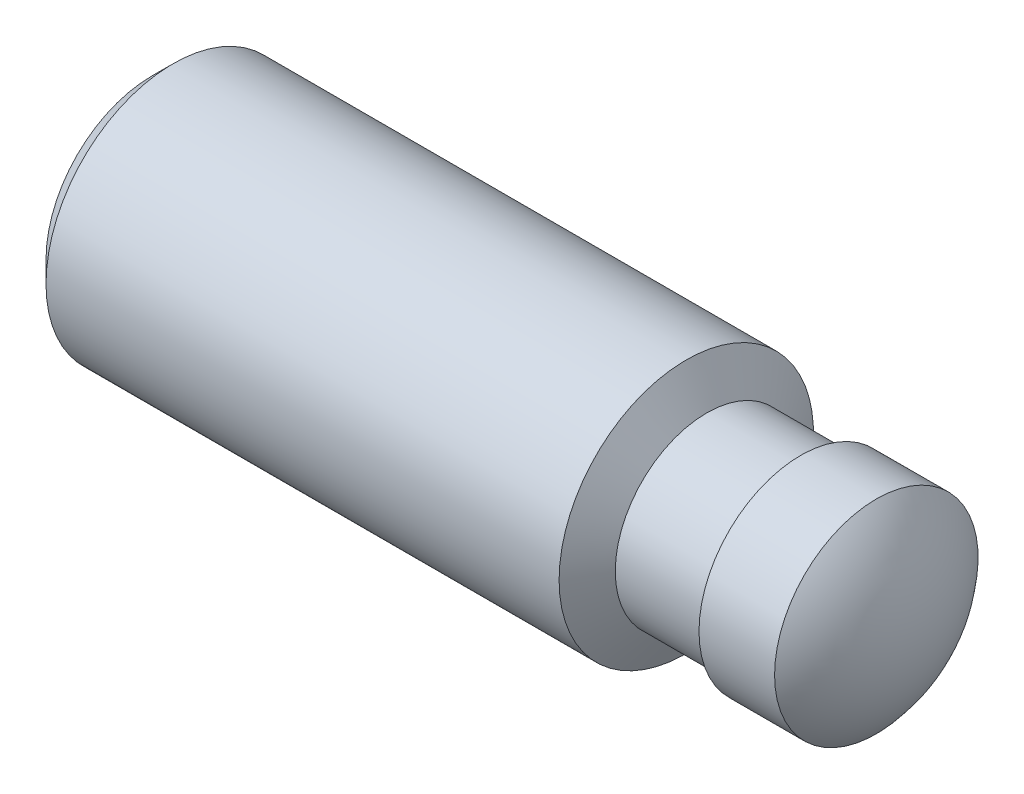
ISO-10303-21;
HEADER;
FILE_DESCRIPTION(('STEP AP214'),'2;1');
FILE_NAME('part.step','',(''),(''),'','','');
FILE_SCHEMA(('AUTOMOTIVE_DESIGN { 1 0 10303 214 1 1 1 1 }'));
ENDSEC;
DATA;
#1=APPLICATION_CONTEXT('core data for automotive mechanical design processes');
#2=APPLICATION_PROTOCOL_DEFINITION('international standard','automotive_design',2000,#1);
#3=PRODUCT_CONTEXT('',#1,'mechanical');
#4=PRODUCT('Part','Part','',(#3));
#5=PRODUCT_RELATED_PRODUCT_CATEGORY('part','',(#4));
#6=PRODUCT_DEFINITION_FORMATION('','',#4);
#7=PRODUCT_DEFINITION_CONTEXT('part definition',#1,'design');
#8=PRODUCT_DEFINITION('design','',#6,#7);
#9=PRODUCT_DEFINITION_SHAPE('','',#8);
#10=(LENGTH_UNIT() NAMED_UNIT(*) SI_UNIT(.MILLI.,.METRE.));
#11=(NAMED_UNIT(*) PLANE_ANGLE_UNIT() SI_UNIT($,.RADIAN.));
#12=(NAMED_UNIT(*) SI_UNIT($,.STERADIAN.) SOLID_ANGLE_UNIT());
#13=UNCERTAINTY_MEASURE_WITH_UNIT(LENGTH_MEASURE(1.E-05),#10,'distance_accuracy_value','');
#14=(GEOMETRIC_REPRESENTATION_CONTEXT(3) GLOBAL_UNCERTAINTY_ASSIGNED_CONTEXT((#13)) GLOBAL_UNIT_ASSIGNED_CONTEXT((#10,
#11,#12)) REPRESENTATION_CONTEXT('',''));
#15=CARTESIAN_POINT('',(0.,0.,0.));
#16=DIRECTION('',(0.,0.,1.));
#17=DIRECTION('',(1.,0.,0.));
#18=AXIS2_PLACEMENT_3D('',#15,#16,#17);
#19=CARTESIAN_POINT('',(0.,0.,0.));
#20=DIRECTION('',(-1.,0.,0.));
#21=DIRECTION('',(0.,0.,1.));
#22=AXIS2_PLACEMENT_3D('',#19,#20,#21);
#23=PLANE('',#22);
#24=CARTESIAN_POINT('',(0.,0.,0.));
#25=DIRECTION('',(-1.,0.,0.));
#26=DIRECTION('',(0.,0.,1.));
#27=AXIS2_PLACEMENT_3D('',#24,#25,#26);
#28=CIRCLE('',#27,4.172);
#29=CARTESIAN_POINT('',(0.,0.,4.172));
#30=VERTEX_POINT('',#29);
#31=EDGE_CURVE('E10',#30,#30,#28,.T.);
#32=ORIENTED_EDGE('',*,*,#31,.T.);
#33=EDGE_LOOP('',(#32));
#34=FACE_BOUND('',#33,.T.);
#35=ADVANCED_FACE('F30',(#34),#23,.T.);
#36=CARTESIAN_POINT('',(0.,0.,0.));
#37=DIRECTION('',(1.,0.,0.));
#38=DIRECTION('',(0.,0.,-1.));
#39=AXIS2_PLACEMENT_3D('',#36,#37,#38);
#40=CONICAL_SURFACE('',#39,4.172,0.78539816339745);
#41=CARTESIAN_POINT('',(0.827999999999997,0.,0.));
#42=DIRECTION('',(-1.,0.,0.));
#43=DIRECTION('',(0.,0.,1.));
#44=AXIS2_PLACEMENT_3D('',#41,#42,#43);
#45=CIRCLE('',#44,5.);
#46=CARTESIAN_POINT('',(0.827999999999997,0.,5.));
#47=VERTEX_POINT('',#46);
#48=EDGE_CURVE('E36',#47,#47,#45,.T.);
#49=ORIENTED_EDGE('',*,*,#48,.T.);
#50=EDGE_LOOP('',(#49));
#51=FACE_BOUND('',#50,.T.);
#52=ORIENTED_EDGE('',*,*,#31,.F.);
#53=EDGE_LOOP('',(#52));
#54=FACE_BOUND('',#53,.T.);
#55=ADVANCED_FACE('F71',(#51,#54),#40,.T.);
#56=CARTESIAN_POINT('',(-3.175,0.,0.));
#57=DIRECTION('',(-1.,0.,0.));
#58=DIRECTION('',(0.,0.,1.));
#59=AXIS2_PLACEMENT_3D('',#56,#57,#58);
#60=CYLINDRICAL_SURFACE('',#59,5.);
#61=CARTESIAN_POINT('',(21.,0.,0.));
#62=DIRECTION('',(-1.,0.,0.));
#63=DIRECTION('',(0.,0.,1.));
#64=AXIS2_PLACEMENT_3D('',#61,#62,#63);
#65=CIRCLE('',#64,5.);
#66=CARTESIAN_POINT('',(21.,0.,5.));
#67=VERTEX_POINT('',#66);
#68=EDGE_CURVE('E40',#67,#67,#65,.T.);
#69=ORIENTED_EDGE('',*,*,#68,.T.);
#70=EDGE_LOOP('',(#69));
#71=FACE_BOUND('',#70,.T.);
#72=ORIENTED_EDGE('',*,*,#48,.F.);
#73=EDGE_LOOP('',(#72));
#74=FACE_BOUND('',#73,.T.);
#75=ADVANCED_FACE('F75',(#71,#74),#60,.T.);
#76=CARTESIAN_POINT('',(21.8082903768655,0.,0.));
#77=DIRECTION('',(-1.,0.,0.));
#78=DIRECTION('',(0.,0.,1.));
#79=AXIS2_PLACEMENT_3D('',#76,#77,#78);
#80=CONICAL_SURFACE('',#79,3.6,1.04719755119659);
#81=ORIENTED_EDGE('',*,*,#68,.F.);
#82=EDGE_LOOP('',(#81));
#83=FACE_BOUND('',#82,.T.);
#84=CARTESIAN_POINT('',(21.8082903768655,0.,0.));
#85=DIRECTION('',(-1.,0.,0.));
#86=DIRECTION('',(0.,0.,1.));
#87=AXIS2_PLACEMENT_3D('',#84,#85,#86);
#88=CIRCLE('',#87,3.6);
#89=CARTESIAN_POINT('',(21.8082903768655,0.,3.6));
#90=VERTEX_POINT('',#89);
#91=EDGE_CURVE('E44',#90,#90,#88,.T.);
#92=ORIENTED_EDGE('',*,*,#91,.T.);
#93=EDGE_LOOP('',(#92));
#94=FACE_BOUND('',#93,.T.);
#95=ADVANCED_FACE('F79',(#83,#94),#80,.T.);
#96=CARTESIAN_POINT('',(-3.175,0.,0.));
#97=DIRECTION('',(-1.,0.,0.));
#98=DIRECTION('',(0.,0.,1.));
#99=AXIS2_PLACEMENT_3D('',#96,#97,#98);
#100=CYLINDRICAL_SURFACE('',#99,3.6);
#101=CARTESIAN_POINT('',(25.5,0.,0.));
#102=DIRECTION('',(-1.,0.,0.));
#103=DIRECTION('',(0.,0.,1.));
#104=AXIS2_PLACEMENT_3D('',#101,#102,#103);
#105=CIRCLE('',#104,3.6);
#106=CARTESIAN_POINT('',(25.5,0.,3.6));
#107=VERTEX_POINT('',#106);
#108=EDGE_CURVE('E49',#107,#107,#105,.T.);
#109=ORIENTED_EDGE('',*,*,#108,.T.);
#110=EDGE_LOOP('',(#109));
#111=FACE_BOUND('',#110,.T.);
#112=ORIENTED_EDGE('',*,*,#91,.F.);
#113=EDGE_LOOP('',(#112));
#114=FACE_BOUND('',#113,.T.);
#115=ADVANCED_FACE('F86',(#111,#114),#100,.T.);
#116=CARTESIAN_POINT('',(25.5,3.6,0.));
#117=DIRECTION('',(-1.,0.,0.));
#118=DIRECTION('',(0.,0.,1.));
#119=AXIS2_PLACEMENT_3D('',#116,#117,#118);
#120=PLANE('',#119);
#121=CARTESIAN_POINT('',(25.5,0.,0.));
#122=DIRECTION('',(-1.,0.,0.));
#123=DIRECTION('',(0.,0.,1.));
#124=AXIS2_PLACEMENT_3D('',#121,#122,#123);
#125=CIRCLE('',#124,4.);
#126=CARTESIAN_POINT('',(25.5,0.,4.));
#127=VERTEX_POINT('',#126);
#128=EDGE_CURVE('E52',#127,#127,#125,.T.);
#129=ORIENTED_EDGE('',*,*,#128,.T.);
#130=EDGE_LOOP('',(#129));
#131=FACE_BOUND('',#130,.T.);
#132=ORIENTED_EDGE('',*,*,#108,.F.);
#133=EDGE_LOOP('',(#132));
#134=FACE_BOUND('',#133,.T.);
#135=ADVANCED_FACE('F68',(#131,#134),#120,.T.);
#136=CARTESIAN_POINT('',(-3.175,0.,0.));
#137=DIRECTION('',(-1.,0.,0.));
#138=DIRECTION('',(0.,0.,1.));
#139=AXIS2_PLACEMENT_3D('',#136,#137,#138);
#140=CYLINDRICAL_SURFACE('',#139,4.);
#141=CARTESIAN_POINT('',(28.4721359549996,0.,0.));
#142=DIRECTION('',(-1.,0.,0.));
#143=DIRECTION('',(0.,0.,1.));
#144=AXIS2_PLACEMENT_3D('',#141,#142,#143);
#145=CIRCLE('',#144,4.);
#146=CARTESIAN_POINT('',(28.4721359549996,0.,4.));
#147=VERTEX_POINT('',#146);
#148=EDGE_CURVE('E55',#147,#147,#145,.T.);
#149=ORIENTED_EDGE('',*,*,#148,.T.);
#150=EDGE_LOOP('',(#149));
#151=FACE_BOUND('',#150,.T.);
#152=ORIENTED_EDGE('',*,*,#128,.F.);
#153=EDGE_LOOP('',(#152));
#154=FACE_BOUND('',#153,.T.);
#155=ADVANCED_FACE('F59',(#151,#154),#140,.T.);
#156=CARTESIAN_POINT('',(24.,0.,0.));
#157=DIRECTION('',(-1.,0.,0.));
#158=DIRECTION('',(0.,1.,0.));
#159=AXIS2_PLACEMENT_3D('',#156,#157,#158);
#160=SPHERICAL_SURFACE('',#159,6.);
#161=ORIENTED_EDGE('',*,*,#148,.F.);
#162=EDGE_LOOP('',(#161));
#163=FACE_BOUND('',#162,.T.);
#164=ADVANCED_FACE('F62',(#163),#160,.T.);
#165=CLOSED_SHELL('',(#35,#55,#75,#95,#115,#135,#155,#164));
#166=MANIFOLD_SOLID_BREP('B2',#165);
#167=ADVANCED_BREP_SHAPE_REPRESENTATION('',(#18,#166),#14);
#168=SHAPE_DEFINITION_REPRESENTATION(#9,#167);
ENDSEC;
END-ISO-10303-21;
